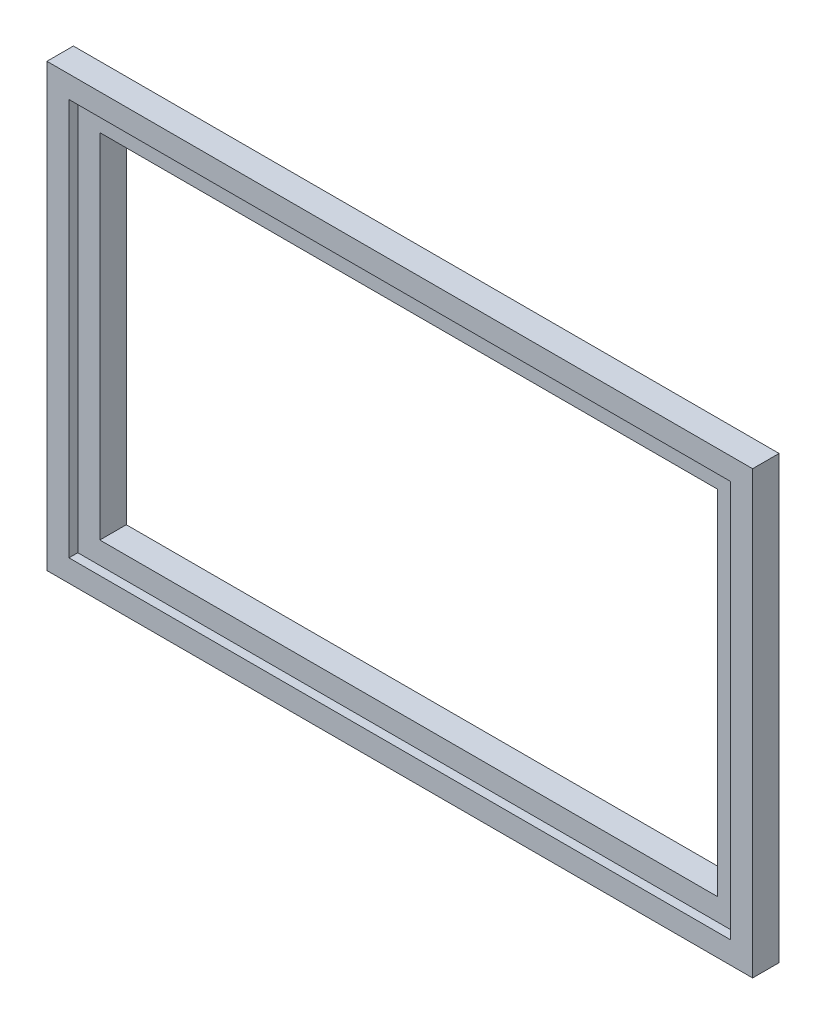
ISO-10303-21;
HEADER;
FILE_DESCRIPTION(('STEP AP214'),'2;1');
FILE_NAME('part.step','',(''),(''),'','','');
FILE_SCHEMA(('AUTOMOTIVE_DESIGN { 1 0 10303 214 1 1 1 1 }'));
ENDSEC;
DATA;
#1=APPLICATION_CONTEXT('core data for automotive mechanical design processes');
#2=APPLICATION_PROTOCOL_DEFINITION('international standard','automotive_design',2000,#1);
#3=PRODUCT_CONTEXT('',#1,'mechanical');
#4=PRODUCT('Part','Part','',(#3));
#5=PRODUCT_RELATED_PRODUCT_CATEGORY('part','',(#4));
#6=PRODUCT_DEFINITION_FORMATION('','',#4);
#7=PRODUCT_DEFINITION_CONTEXT('part definition',#1,'design');
#8=PRODUCT_DEFINITION('design','',#6,#7);
#9=PRODUCT_DEFINITION_SHAPE('','',#8);
#10=(LENGTH_UNIT() NAMED_UNIT(*) SI_UNIT(.MILLI.,.METRE.));
#11=(NAMED_UNIT(*) PLANE_ANGLE_UNIT() SI_UNIT($,.RADIAN.));
#12=(NAMED_UNIT(*) SI_UNIT($,.STERADIAN.) SOLID_ANGLE_UNIT());
#13=UNCERTAINTY_MEASURE_WITH_UNIT(LENGTH_MEASURE(1.E-05),#10,'distance_accuracy_value','');
#14=(GEOMETRIC_REPRESENTATION_CONTEXT(3) GLOBAL_UNCERTAINTY_ASSIGNED_CONTEXT((#13)) GLOBAL_UNIT_ASSIGNED_CONTEXT((#10,
#11,#12)) REPRESENTATION_CONTEXT('',''));
#15=CARTESIAN_POINT('',(0.,0.,0.));
#16=DIRECTION('',(0.,0.,1.));
#17=DIRECTION('',(1.,0.,0.));
#18=AXIS2_PLACEMENT_3D('',#15,#16,#17);
#19=CARTESIAN_POINT('',(0.,0.,0.));
#20=DIRECTION('',(0.,0.,1.));
#21=DIRECTION('',(1.,0.,0.));
#22=AXIS2_PLACEMENT_3D('',#19,#20,#21);
#23=PLANE('',#22);
#24=DIRECTION('',(-1.,0.,0.));
#25=VECTOR('',#24,1.);
#26=CARTESIAN_POINT('',(0.,50.,0.));
#27=LINE('',#26,#25);
#28=CARTESIAN_POINT('',(0.,50.,0.));
#29=VERTEX_POINT('',#28);
#30=CARTESIAN_POINT('',(-80.,50.,0.));
#31=VERTEX_POINT('',#30);
#32=EDGE_CURVE('E286',#29,#31,#27,.T.);
#33=ORIENTED_EDGE('',*,*,#32,.F.);
#34=DIRECTION('',(0.,1.,0.));
#35=VECTOR('',#34,1.);
#36=CARTESIAN_POINT('',(0.,0.,0.));
#37=LINE('',#36,#35);
#38=CARTESIAN_POINT('',(0.,0.,0.));
#39=VERTEX_POINT('',#38);
#40=EDGE_CURVE('E290',#39,#29,#37,.T.);
#41=ORIENTED_EDGE('',*,*,#40,.F.);
#42=DIRECTION('',(1.,0.,0.));
#43=VECTOR('',#42,1.);
#44=CARTESIAN_POINT('',(0.,0.,0.));
#45=LINE('',#44,#43);
#46=CARTESIAN_POINT('',(-80.,0.,0.));
#47=VERTEX_POINT('',#46);
#48=EDGE_CURVE('E307',#47,#39,#45,.T.);
#49=ORIENTED_EDGE('',*,*,#48,.F.);
#50=DIRECTION('',(0.,-1.,0.));
#51=VECTOR('',#50,1.);
#52=CARTESIAN_POINT('',(-80.,0.,0.));
#53=LINE('',#52,#51);
#54=EDGE_CURVE('E304',#31,#47,#53,.T.);
#55=ORIENTED_EDGE('',*,*,#54,.F.);
#56=EDGE_LOOP('',(#33,#41,#49,#55));
#57=FACE_BOUND('',#56,.T.);
#58=DIRECTION('',(1.,0.,0.));
#59=VECTOR('',#58,1.);
#60=CARTESIAN_POINT('',(0.,47.5,0.));
#61=LINE('',#60,#59);
#62=CARTESIAN_POINT('',(-77.5,47.5,0.));
#63=VERTEX_POINT('',#62);
#64=CARTESIAN_POINT('',(-2.49999999999999,47.5,0.));
#65=VERTEX_POINT('',#64);
#66=EDGE_CURVE('E206',#63,#65,#61,.T.);
#67=ORIENTED_EDGE('',*,*,#66,.F.);
#68=DIRECTION('',(0.,1.,0.));
#69=VECTOR('',#68,1.);
#70=CARTESIAN_POINT('',(-77.5,0.,0.));
#71=LINE('',#70,#69);
#72=CARTESIAN_POINT('',(-77.5,2.5,0.));
#73=VERTEX_POINT('',#72);
#74=EDGE_CURVE('E182',#73,#63,#71,.T.);
#75=ORIENTED_EDGE('',*,*,#74,.F.);
#76=DIRECTION('',(-1.,0.,0.));
#77=VECTOR('',#76,1.);
#78=CARTESIAN_POINT('',(0.,2.5,0.));
#79=LINE('',#78,#77);
#80=CARTESIAN_POINT('',(-2.49999999999999,2.5,0.));
#81=VERTEX_POINT('',#80);
#82=EDGE_CURVE('E64',#81,#73,#79,.T.);
#83=ORIENTED_EDGE('',*,*,#82,.F.);
#84=DIRECTION('',(0.,-1.,0.));
#85=VECTOR('',#84,1.);
#86=CARTESIAN_POINT('',(-2.49999999999999,0.,0.));
#87=LINE('',#86,#85);
#88=EDGE_CURVE('E59',#65,#81,#87,.T.);
#89=ORIENTED_EDGE('',*,*,#88,.F.);
#90=EDGE_LOOP('',(#67,#75,#83,#89));
#91=FACE_BOUND('',#90,.T.);
#92=ADVANCED_FACE('F41',(#57,#91),#23,.F.);
#93=CARTESIAN_POINT('',(0.,0.,2.));
#94=DIRECTION('',(0.,0.,1.));
#95=DIRECTION('',(1.,0.,0.));
#96=AXIS2_PLACEMENT_3D('',#93,#94,#95);
#97=PLANE('',#96);
#98=DIRECTION('',(0.,-1.,0.));
#99=VECTOR('',#98,1.);
#100=CARTESIAN_POINT('',(-75.,0.,2.));
#101=LINE('',#100,#99);
#102=CARTESIAN_POINT('',(-75.,45.,2.));
#103=VERTEX_POINT('',#102);
#104=CARTESIAN_POINT('',(-75.,5.,2.));
#105=VERTEX_POINT('',#104);
#106=EDGE_CURVE('E287',#103,#105,#101,.T.);
#107=ORIENTED_EDGE('',*,*,#106,.F.);
#108=DIRECTION('',(-1.,0.,0.));
#109=VECTOR('',#108,1.);
#110=CARTESIAN_POINT('',(0.,45.,2.));
#111=LINE('',#110,#109);
#112=CARTESIAN_POINT('',(-5.,45.,2.));
#113=VERTEX_POINT('',#112);
#114=EDGE_CURVE('E160',#113,#103,#111,.T.);
#115=ORIENTED_EDGE('',*,*,#114,.F.);
#116=DIRECTION('',(0.,1.,0.));
#117=VECTOR('',#116,1.);
#118=CARTESIAN_POINT('',(-5.,0.,2.));
#119=LINE('',#118,#117);
#120=CARTESIAN_POINT('',(-5.,5.,2.));
#121=VERTEX_POINT('',#120);
#122=EDGE_CURVE('E293',#121,#113,#119,.T.);
#123=ORIENTED_EDGE('',*,*,#122,.F.);
#124=DIRECTION('',(1.,0.,0.));
#125=VECTOR('',#124,1.);
#126=CARTESIAN_POINT('',(0.,5.,2.));
#127=LINE('',#126,#125);
#128=EDGE_CURVE('E297',#105,#121,#127,.T.);
#129=ORIENTED_EDGE('',*,*,#128,.F.);
#130=EDGE_LOOP('',(#107,#115,#123,#129));
#131=FACE_BOUND('',#130,.T.);
#132=DIRECTION('',(1.,0.,0.));
#133=VECTOR('',#132,1.);
#134=CARTESIAN_POINT('',(-77.5,2.5,2.));
#135=LINE('',#134,#133);
#136=CARTESIAN_POINT('',(-77.5,2.5,2.));
#137=VERTEX_POINT('',#136);
#138=CARTESIAN_POINT('',(-2.5,2.5,2.));
#139=VERTEX_POINT('',#138);
#140=EDGE_CURVE('E233',#137,#139,#135,.T.);
#141=ORIENTED_EDGE('',*,*,#140,.T.);
#142=DIRECTION('',(0.,1.,0.));
#143=VECTOR('',#142,1.);
#144=CARTESIAN_POINT('',(-2.5,2.5,2.));
#145=LINE('',#144,#143);
#146=CARTESIAN_POINT('',(-2.49999999999999,47.5,2.));
#147=VERTEX_POINT('',#146);
#148=EDGE_CURVE('E228',#139,#147,#145,.T.);
#149=ORIENTED_EDGE('',*,*,#148,.T.);
#150=DIRECTION('',(-1.,0.,0.));
#151=VECTOR('',#150,1.);
#152=CARTESIAN_POINT('',(-2.49999999999999,47.5,2.));
#153=LINE('',#152,#151);
#154=CARTESIAN_POINT('',(-77.5,47.5,2.));
#155=VERTEX_POINT('',#154);
#156=EDGE_CURVE('E247',#147,#155,#153,.T.);
#157=ORIENTED_EDGE('',*,*,#156,.T.);
#158=DIRECTION('',(0.,-1.,0.));
#159=VECTOR('',#158,1.);
#160=CARTESIAN_POINT('',(-77.5,47.5,2.));
#161=LINE('',#160,#159);
#162=EDGE_CURVE('E251',#155,#137,#161,.T.);
#163=ORIENTED_EDGE('',*,*,#162,.T.);
#164=EDGE_LOOP('',(#141,#149,#157,#163));
#165=FACE_BOUND('',#164,.T.);
#166=ADVANCED_FACE('F331',(#131,#165),#97,.T.);
#167=CARTESIAN_POINT('',(0.,50.,2.));
#168=DIRECTION('',(0.,-1.,0.));
#169=DIRECTION('',(0.,0.,-1.));
#170=AXIS2_PLACEMENT_3D('',#167,#168,#169);
#171=PLANE('',#170);
#172=ORIENTED_EDGE('',*,*,#32,.T.);
#173=DIRECTION('',(0.,0.,-1.));
#174=VECTOR('',#173,1.);
#175=CARTESIAN_POINT('',(-80.,50.,2.));
#176=LINE('',#175,#174);
#177=CARTESIAN_POINT('',(-80.,50.,3.));
#178=VERTEX_POINT('',#177);
#179=EDGE_CURVE('E11',#178,#31,#176,.T.);
#180=ORIENTED_EDGE('',*,*,#179,.F.);
#181=DIRECTION('',(-1.,0.,0.));
#182=VECTOR('',#181,1.);
#183=CARTESIAN_POINT('',(0.,50.,3.));
#184=LINE('',#183,#182);
#185=CARTESIAN_POINT('',(0.,50.,3.));
#186=VERTEX_POINT('',#185);
#187=EDGE_CURVE('E282',#186,#178,#184,.T.);
#188=ORIENTED_EDGE('',*,*,#187,.F.);
#189=DIRECTION('',(0.,0.,-1.));
#190=VECTOR('',#189,1.);
#191=CARTESIAN_POINT('',(0.,50.,2.));
#192=LINE('',#191,#190);
#193=EDGE_CURVE('E165',#186,#29,#192,.T.);
#194=ORIENTED_EDGE('',*,*,#193,.T.);
#195=EDGE_LOOP('',(#172,#180,#188,#194));
#196=FACE_BOUND('',#195,.T.);
#197=ADVANCED_FACE('F354',(#196),#171,.F.);
#198=CARTESIAN_POINT('',(-80.,0.,2.));
#199=DIRECTION('',(1.,0.,0.));
#200=DIRECTION('',(0.,1.,0.));
#201=AXIS2_PLACEMENT_3D('',#198,#199,#200);
#202=PLANE('',#201);
#203=ORIENTED_EDGE('',*,*,#54,.T.);
#204=DIRECTION('',(0.,0.,-1.));
#205=VECTOR('',#204,1.);
#206=CARTESIAN_POINT('',(-80.,0.,2.));
#207=LINE('',#206,#205);
#208=CARTESIAN_POINT('',(-80.,0.,3.));
#209=VERTEX_POINT('',#208);
#210=EDGE_CURVE('E51',#209,#47,#207,.T.);
#211=ORIENTED_EDGE('',*,*,#210,.F.);
#212=DIRECTION('',(0.,-1.,0.));
#213=VECTOR('',#212,1.);
#214=CARTESIAN_POINT('',(-80.,50.,3.));
#215=LINE('',#214,#213);
#216=EDGE_CURVE('E270',#178,#209,#215,.T.);
#217=ORIENTED_EDGE('',*,*,#216,.F.);
#218=ORIENTED_EDGE('',*,*,#179,.T.);
#219=EDGE_LOOP('',(#203,#211,#217,#218));
#220=FACE_BOUND('',#219,.T.);
#221=ADVANCED_FACE('F362',(#220),#202,.F.);
#222=CARTESIAN_POINT('',(0.,0.,2.));
#223=DIRECTION('',(0.,1.,0.));
#224=DIRECTION('',(0.,0.,1.));
#225=AXIS2_PLACEMENT_3D('',#222,#223,#224);
#226=PLANE('',#225);
#227=ORIENTED_EDGE('',*,*,#48,.T.);
#228=DIRECTION('',(0.,0.,-1.));
#229=VECTOR('',#228,1.);
#230=CARTESIAN_POINT('',(0.,0.,2.));
#231=LINE('',#230,#229);
#232=CARTESIAN_POINT('',(0.,0.,3.));
#233=VERTEX_POINT('',#232);
#234=EDGE_CURVE('E315',#233,#39,#231,.T.);
#235=ORIENTED_EDGE('',*,*,#234,.F.);
#236=DIRECTION('',(1.,0.,0.));
#237=VECTOR('',#236,1.);
#238=CARTESIAN_POINT('',(-80.,0.,3.));
#239=LINE('',#238,#237);
#240=EDGE_CURVE('E274',#209,#233,#239,.T.);
#241=ORIENTED_EDGE('',*,*,#240,.F.);
#242=ORIENTED_EDGE('',*,*,#210,.T.);
#243=EDGE_LOOP('',(#227,#235,#241,#242));
#244=FACE_BOUND('',#243,.T.);
#245=ADVANCED_FACE('F359',(#244),#226,.F.);
#246=CARTESIAN_POINT('',(-75.,0.,2.));
#247=DIRECTION('',(1.,0.,0.));
#248=DIRECTION('',(0.,0.,-1.));
#249=AXIS2_PLACEMENT_3D('',#246,#247,#248);
#250=PLANE('',#249);
#251=DIRECTION('',(0.,0.,-1.));
#252=VECTOR('',#251,1.);
#253=CARTESIAN_POINT('',(-75.,5.,2.));
#254=LINE('',#253,#252);
#255=CARTESIAN_POINT('',(-75.,5.,-1.));
#256=VERTEX_POINT('',#255);
#257=EDGE_CURVE('E169',#105,#256,#254,.T.);
#258=ORIENTED_EDGE('',*,*,#257,.T.);
#259=DIRECTION('',(0.,-1.,0.));
#260=VECTOR('',#259,1.);
#261=CARTESIAN_POINT('',(-75.,0.,-1.));
#262=LINE('',#261,#260);
#263=CARTESIAN_POINT('',(-75.,45.,-1.));
#264=VERTEX_POINT('',#263);
#265=EDGE_CURVE('E168',#264,#256,#262,.T.);
#266=ORIENTED_EDGE('',*,*,#265,.F.);
#267=DIRECTION('',(0.,0.,-1.));
#268=VECTOR('',#267,1.);
#269=CARTESIAN_POINT('',(-75.,45.,2.));
#270=LINE('',#269,#268);
#271=EDGE_CURVE('E45',#103,#264,#270,.T.);
#272=ORIENTED_EDGE('',*,*,#271,.F.);
#273=ORIENTED_EDGE('',*,*,#106,.T.);
#274=EDGE_LOOP('',(#258,#266,#272,#273));
#275=FACE_BOUND('',#274,.T.);
#276=ADVANCED_FACE('F43',(#275),#250,.T.);
#277=CARTESIAN_POINT('',(0.,45.,2.));
#278=DIRECTION('',(0.,-1.,0.));
#279=DIRECTION('',(0.,0.,-1.));
#280=AXIS2_PLACEMENT_3D('',#277,#278,#279);
#281=PLANE('',#280);
#282=ORIENTED_EDGE('',*,*,#271,.T.);
#283=DIRECTION('',(-1.,0.,0.));
#284=VECTOR('',#283,1.);
#285=CARTESIAN_POINT('',(0.,45.,-1.));
#286=LINE('',#285,#284);
#287=CARTESIAN_POINT('',(-5.,45.,-1.));
#288=VERTEX_POINT('',#287);
#289=EDGE_CURVE('E158',#288,#264,#286,.T.);
#290=ORIENTED_EDGE('',*,*,#289,.F.);
#291=DIRECTION('',(0.,0.,-1.));
#292=VECTOR('',#291,1.);
#293=CARTESIAN_POINT('',(-5.,45.,2.));
#294=LINE('',#293,#292);
#295=EDGE_CURVE('E166',#113,#288,#294,.T.);
#296=ORIENTED_EDGE('',*,*,#295,.F.);
#297=ORIENTED_EDGE('',*,*,#114,.T.);
#298=EDGE_LOOP('',(#282,#290,#296,#297));
#299=FACE_BOUND('',#298,.T.);
#300=ADVANCED_FACE('F156',(#299),#281,.T.);
#301=CARTESIAN_POINT('',(-5.,0.,2.));
#302=DIRECTION('',(-1.,0.,0.));
#303=DIRECTION('',(0.,0.,1.));
#304=AXIS2_PLACEMENT_3D('',#301,#302,#303);
#305=PLANE('',#304);
#306=ORIENTED_EDGE('',*,*,#295,.T.);
#307=DIRECTION('',(0.,1.,0.));
#308=VECTOR('',#307,1.);
#309=CARTESIAN_POINT('',(-5.,0.,-1.));
#310=LINE('',#309,#308);
#311=CARTESIAN_POINT('',(-5.,5.,-1.));
#312=VERTEX_POINT('',#311);
#313=EDGE_CURVE('E180',#312,#288,#310,.T.);
#314=ORIENTED_EDGE('',*,*,#313,.F.);
#315=DIRECTION('',(0.,0.,-1.));
#316=VECTOR('',#315,1.);
#317=CARTESIAN_POINT('',(-5.,5.,2.));
#318=LINE('',#317,#316);
#319=EDGE_CURVE('E324',#121,#312,#318,.T.);
#320=ORIENTED_EDGE('',*,*,#319,.F.);
#321=ORIENTED_EDGE('',*,*,#122,.T.);
#322=EDGE_LOOP('',(#306,#314,#320,#321));
#323=FACE_BOUND('',#322,.T.);
#324=ADVANCED_FACE('F328',(#323),#305,.T.);
#325=CARTESIAN_POINT('',(0.,5.,2.));
#326=DIRECTION('',(0.,1.,0.));
#327=DIRECTION('',(0.,0.,1.));
#328=AXIS2_PLACEMENT_3D('',#325,#326,#327);
#329=PLANE('',#328);
#330=ORIENTED_EDGE('',*,*,#319,.T.);
#331=DIRECTION('',(1.,0.,0.));
#332=VECTOR('',#331,1.);
#333=CARTESIAN_POINT('',(0.,5.,-1.));
#334=LINE('',#333,#332);
#335=EDGE_CURVE('E174',#256,#312,#334,.T.);
#336=ORIENTED_EDGE('',*,*,#335,.F.);
#337=ORIENTED_EDGE('',*,*,#257,.F.);
#338=ORIENTED_EDGE('',*,*,#128,.T.);
#339=EDGE_LOOP('',(#330,#336,#337,#338));
#340=FACE_BOUND('',#339,.T.);
#341=ADVANCED_FACE('F335',(#340),#329,.T.);
#342=CARTESIAN_POINT('',(0.,0.,2.));
#343=DIRECTION('',(-1.,0.,0.));
#344=DIRECTION('',(0.,-1.,0.));
#345=AXIS2_PLACEMENT_3D('',#342,#343,#344);
#346=PLANE('',#345);
#347=ORIENTED_EDGE('',*,*,#40,.T.);
#348=ORIENTED_EDGE('',*,*,#193,.F.);
#349=DIRECTION('',(0.,1.,0.));
#350=VECTOR('',#349,1.);
#351=CARTESIAN_POINT('',(0.,0.,3.));
#352=LINE('',#351,#350);
#353=EDGE_CURVE('E278',#233,#186,#352,.T.);
#354=ORIENTED_EDGE('',*,*,#353,.F.);
#355=ORIENTED_EDGE('',*,*,#234,.T.);
#356=EDGE_LOOP('',(#347,#348,#354,#355));
#357=FACE_BOUND('',#356,.T.);
#358=ADVANCED_FACE('F337',(#357),#346,.F.);
#359=CARTESIAN_POINT('',(0.,0.,3.));
#360=DIRECTION('',(0.,0.,1.));
#361=DIRECTION('',(1.,0.,0.));
#362=AXIS2_PLACEMENT_3D('',#359,#360,#361);
#363=PLANE('',#362);
#364=ORIENTED_EDGE('',*,*,#216,.T.);
#365=ORIENTED_EDGE('',*,*,#240,.T.);
#366=ORIENTED_EDGE('',*,*,#353,.T.);
#367=ORIENTED_EDGE('',*,*,#187,.T.);
#368=EDGE_LOOP('',(#364,#365,#366,#367));
#369=FACE_BOUND('',#368,.T.);
#370=DIRECTION('',(-1.,0.,0.));
#371=VECTOR('',#370,1.);
#372=CARTESIAN_POINT('',(-2.49999999999999,47.5,3.));
#373=LINE('',#372,#371);
#374=CARTESIAN_POINT('',(-2.49999999999999,47.5,3.));
#375=VERTEX_POINT('',#374);
#376=CARTESIAN_POINT('',(-77.5,47.5,3.));
#377=VERTEX_POINT('',#376);
#378=EDGE_CURVE('E232',#375,#377,#373,.T.);
#379=ORIENTED_EDGE('',*,*,#378,.F.);
#380=DIRECTION('',(0.,1.,0.));
#381=VECTOR('',#380,1.);
#382=CARTESIAN_POINT('',(-2.5,2.5,3.));
#383=LINE('',#382,#381);
#384=CARTESIAN_POINT('',(-2.5,2.5,3.));
#385=VERTEX_POINT('',#384);
#386=EDGE_CURVE('E229',#385,#375,#383,.T.);
#387=ORIENTED_EDGE('',*,*,#386,.F.);
#388=DIRECTION('',(1.,0.,0.));
#389=VECTOR('',#388,1.);
#390=CARTESIAN_POINT('',(-77.5,2.5,3.));
#391=LINE('',#390,#389);
#392=CARTESIAN_POINT('',(-77.5,2.5,3.));
#393=VERTEX_POINT('',#392);
#394=EDGE_CURVE('E240',#393,#385,#391,.T.);
#395=ORIENTED_EDGE('',*,*,#394,.F.);
#396=DIRECTION('',(0.,-1.,0.));
#397=VECTOR('',#396,1.);
#398=CARTESIAN_POINT('',(-77.5,47.5,3.));
#399=LINE('',#398,#397);
#400=EDGE_CURVE('E236',#377,#393,#399,.T.);
#401=ORIENTED_EDGE('',*,*,#400,.F.);
#402=EDGE_LOOP('',(#379,#387,#395,#401));
#403=FACE_BOUND('',#402,.T.);
#404=ADVANCED_FACE('F343',(#369,#403),#363,.T.);
#405=CARTESIAN_POINT('',(-2.5,2.5,3.));
#406=DIRECTION('',(-1.,0.,0.));
#407=DIRECTION('',(0.,-1.,0.));
#408=AXIS2_PLACEMENT_3D('',#405,#406,#407);
#409=PLANE('',#408);
#410=ORIENTED_EDGE('',*,*,#148,.F.);
#411=DIRECTION('',(0.,0.,-1.));
#412=VECTOR('',#411,1.);
#413=CARTESIAN_POINT('',(-2.5,2.5,3.));
#414=LINE('',#413,#412);
#415=EDGE_CURVE('E243',#385,#139,#414,.T.);
#416=ORIENTED_EDGE('',*,*,#415,.F.);
#417=ORIENTED_EDGE('',*,*,#386,.T.);
#418=DIRECTION('',(0.,0.,-1.));
#419=VECTOR('',#418,1.);
#420=CARTESIAN_POINT('',(-2.49999999999999,47.5,3.));
#421=LINE('',#420,#419);
#422=EDGE_CURVE('E266',#375,#147,#421,.T.);
#423=ORIENTED_EDGE('',*,*,#422,.T.);
#424=EDGE_LOOP('',(#410,#416,#417,#423));
#425=FACE_BOUND('',#424,.T.);
#426=ADVANCED_FACE('F379',(#425),#409,.T.);
#427=CARTESIAN_POINT('',(-2.49999999999999,47.5,3.));
#428=DIRECTION('',(0.,-1.,0.));
#429=DIRECTION('',(0.,0.,-1.));
#430=AXIS2_PLACEMENT_3D('',#427,#428,#429);
#431=PLANE('',#430);
#432=ORIENTED_EDGE('',*,*,#156,.F.);
#433=ORIENTED_EDGE('',*,*,#422,.F.);
#434=ORIENTED_EDGE('',*,*,#378,.T.);
#435=DIRECTION('',(0.,0.,-1.));
#436=VECTOR('',#435,1.);
#437=CARTESIAN_POINT('',(-77.5,47.5,3.));
#438=LINE('',#437,#436);
#439=EDGE_CURVE('E263',#377,#155,#438,.T.);
#440=ORIENTED_EDGE('',*,*,#439,.T.);
#441=EDGE_LOOP('',(#432,#433,#434,#440));
#442=FACE_BOUND('',#441,.T.);
#443=ADVANCED_FACE('F387',(#442),#431,.T.);
#444=CARTESIAN_POINT('',(-77.5,47.5,3.));
#445=DIRECTION('',(1.,0.,0.));
#446=DIRECTION('',(0.,1.,0.));
#447=AXIS2_PLACEMENT_3D('',#444,#445,#446);
#448=PLANE('',#447);
#449=ORIENTED_EDGE('',*,*,#162,.F.);
#450=ORIENTED_EDGE('',*,*,#439,.F.);
#451=ORIENTED_EDGE('',*,*,#400,.T.);
#452=DIRECTION('',(0.,0.,-1.));
#453=VECTOR('',#452,1.);
#454=CARTESIAN_POINT('',(-77.5,2.5,3.));
#455=LINE('',#454,#453);
#456=EDGE_CURVE('E260',#393,#137,#455,.T.);
#457=ORIENTED_EDGE('',*,*,#456,.T.);
#458=EDGE_LOOP('',(#449,#450,#451,#457));
#459=FACE_BOUND('',#458,.T.);
#460=ADVANCED_FACE('F390',(#459),#448,.T.);
#461=CARTESIAN_POINT('',(-77.5,2.5,3.));
#462=DIRECTION('',(0.,1.,0.));
#463=DIRECTION('',(0.,0.,1.));
#464=AXIS2_PLACEMENT_3D('',#461,#462,#463);
#465=PLANE('',#464);
#466=ORIENTED_EDGE('',*,*,#140,.F.);
#467=ORIENTED_EDGE('',*,*,#456,.F.);
#468=ORIENTED_EDGE('',*,*,#394,.T.);
#469=ORIENTED_EDGE('',*,*,#415,.T.);
#470=EDGE_LOOP('',(#466,#467,#468,#469));
#471=FACE_BOUND('',#470,.T.);
#472=ADVANCED_FACE('F396',(#471),#465,.T.);
#473=CARTESIAN_POINT('',(0.,47.5,-1.));
#474=DIRECTION('',(0.,-1.,0.));
#475=DIRECTION('',(0.,0.,-1.));
#476=AXIS2_PLACEMENT_3D('',#473,#474,#475);
#477=PLANE('',#476);
#478=ORIENTED_EDGE('',*,*,#66,.T.);
#479=DIRECTION('',(0.,0.,1.));
#480=VECTOR('',#479,1.);
#481=CARTESIAN_POINT('',(-2.49999999999999,47.5,-1.));
#482=LINE('',#481,#480);
#483=CARTESIAN_POINT('',(-2.49999999999999,47.5,-1.));
#484=VERTEX_POINT('',#483);
#485=EDGE_CURVE('E225',#484,#65,#482,.T.);
#486=ORIENTED_EDGE('',*,*,#485,.F.);
#487=DIRECTION('',(1.,0.,0.));
#488=VECTOR('',#487,1.);
#489=CARTESIAN_POINT('',(0.,47.5,-1.));
#490=LINE('',#489,#488);
#491=CARTESIAN_POINT('',(-77.5,47.5,-1.));
#492=VERTEX_POINT('',#491);
#493=EDGE_CURVE('E192',#492,#484,#490,.T.);
#494=ORIENTED_EDGE('',*,*,#493,.F.);
#495=DIRECTION('',(0.,0.,1.));
#496=VECTOR('',#495,1.);
#497=CARTESIAN_POINT('',(-77.5,47.5,-1.));
#498=LINE('',#497,#496);
#499=EDGE_CURVE('E205',#492,#63,#498,.T.);
#500=ORIENTED_EDGE('',*,*,#499,.T.);
#501=EDGE_LOOP('',(#478,#486,#494,#500));
#502=FACE_BOUND('',#501,.T.);
#503=ADVANCED_FACE('F398',(#502),#477,.F.);
#504=CARTESIAN_POINT('',(-2.49999999999999,0.,-1.));
#505=DIRECTION('',(-1.,0.,0.));
#506=DIRECTION('',(0.,0.,1.));
#507=AXIS2_PLACEMENT_3D('',#504,#505,#506);
#508=PLANE('',#507);
#509=ORIENTED_EDGE('',*,*,#88,.T.);
#510=DIRECTION('',(0.,0.,1.));
#511=VECTOR('',#510,1.);
#512=CARTESIAN_POINT('',(-2.49999999999999,2.5,-1.));
#513=LINE('',#512,#511);
#514=CARTESIAN_POINT('',(-2.49999999999999,2.5,-1.));
#515=VERTEX_POINT('',#514);
#516=EDGE_CURVE('E221',#515,#81,#513,.T.);
#517=ORIENTED_EDGE('',*,*,#516,.F.);
#518=DIRECTION('',(0.,-1.,0.));
#519=VECTOR('',#518,1.);
#520=CARTESIAN_POINT('',(-2.49999999999999,0.,-1.));
#521=LINE('',#520,#519);
#522=EDGE_CURVE('E196',#484,#515,#521,.T.);
#523=ORIENTED_EDGE('',*,*,#522,.F.);
#524=ORIENTED_EDGE('',*,*,#485,.T.);
#525=EDGE_LOOP('',(#509,#517,#523,#524));
#526=FACE_BOUND('',#525,.T.);
#527=ADVANCED_FACE('F404',(#526),#508,.F.);
#528=CARTESIAN_POINT('',(0.,2.5,-1.));
#529=DIRECTION('',(0.,1.,0.));
#530=DIRECTION('',(0.,0.,1.));
#531=AXIS2_PLACEMENT_3D('',#528,#529,#530);
#532=PLANE('',#531);
#533=ORIENTED_EDGE('',*,*,#82,.T.);
#534=DIRECTION('',(0.,0.,1.));
#535=VECTOR('',#534,1.);
#536=CARTESIAN_POINT('',(-77.5,2.5,-1.));
#537=LINE('',#536,#535);
#538=CARTESIAN_POINT('',(-77.5,2.5,-1.));
#539=VERTEX_POINT('',#538);
#540=EDGE_CURVE('E217',#539,#73,#537,.T.);
#541=ORIENTED_EDGE('',*,*,#540,.F.);
#542=DIRECTION('',(-1.,0.,0.));
#543=VECTOR('',#542,1.);
#544=CARTESIAN_POINT('',(0.,2.5,-1.));
#545=LINE('',#544,#543);
#546=EDGE_CURVE('E199',#515,#539,#545,.T.);
#547=ORIENTED_EDGE('',*,*,#546,.F.);
#548=ORIENTED_EDGE('',*,*,#516,.T.);
#549=EDGE_LOOP('',(#533,#541,#547,#548));
#550=FACE_BOUND('',#549,.T.);
#551=ADVANCED_FACE('F477',(#550),#532,.F.);
#552=CARTESIAN_POINT('',(-77.5,0.,-1.));
#553=DIRECTION('',(1.,0.,0.));
#554=DIRECTION('',(0.,0.,-1.));
#555=AXIS2_PLACEMENT_3D('',#552,#553,#554);
#556=PLANE('',#555);
#557=ORIENTED_EDGE('',*,*,#74,.T.);
#558=ORIENTED_EDGE('',*,*,#499,.F.);
#559=DIRECTION('',(0.,1.,0.));
#560=VECTOR('',#559,1.);
#561=CARTESIAN_POINT('',(-77.5,0.,-1.));
#562=LINE('',#561,#560);
#563=EDGE_CURVE('E202',#539,#492,#562,.T.);
#564=ORIENTED_EDGE('',*,*,#563,.F.);
#565=ORIENTED_EDGE('',*,*,#540,.T.);
#566=EDGE_LOOP('',(#557,#558,#564,#565));
#567=FACE_BOUND('',#566,.T.);
#568=ADVANCED_FACE('F486',(#567),#556,.F.);
#569=CARTESIAN_POINT('',(0.,0.,-1.));
#570=DIRECTION('',(0.,0.,-1.));
#571=DIRECTION('',(-1.,0.,0.));
#572=AXIS2_PLACEMENT_3D('',#569,#570,#571);
#573=PLANE('',#572);
#574=ORIENTED_EDGE('',*,*,#289,.T.);
#575=ORIENTED_EDGE('',*,*,#265,.T.);
#576=ORIENTED_EDGE('',*,*,#335,.T.);
#577=ORIENTED_EDGE('',*,*,#313,.T.);
#578=EDGE_LOOP('',(#574,#575,#576,#577));
#579=FACE_BOUND('',#578,.T.);
#580=ORIENTED_EDGE('',*,*,#493,.T.);
#581=ORIENTED_EDGE('',*,*,#522,.T.);
#582=ORIENTED_EDGE('',*,*,#546,.T.);
#583=ORIENTED_EDGE('',*,*,#563,.T.);
#584=EDGE_LOOP('',(#580,#581,#582,#583));
#585=FACE_BOUND('',#584,.T.);
#586=ADVANCED_FACE('F177',(#579,#585),#573,.T.);
#587=CLOSED_SHELL('',(#92,#166,#197,#221,#245,#276,#300,#324,#341,#358,#404,#426,#443,#460,#472,
#503,#527,#551,#568,#586));
#588=MANIFOLD_SOLID_BREP('B2',#587);
#589=ADVANCED_BREP_SHAPE_REPRESENTATION('',(#18,#588),#14);
#590=SHAPE_DEFINITION_REPRESENTATION(#9,#589);
ENDSEC;
END-ISO-10303-21;
